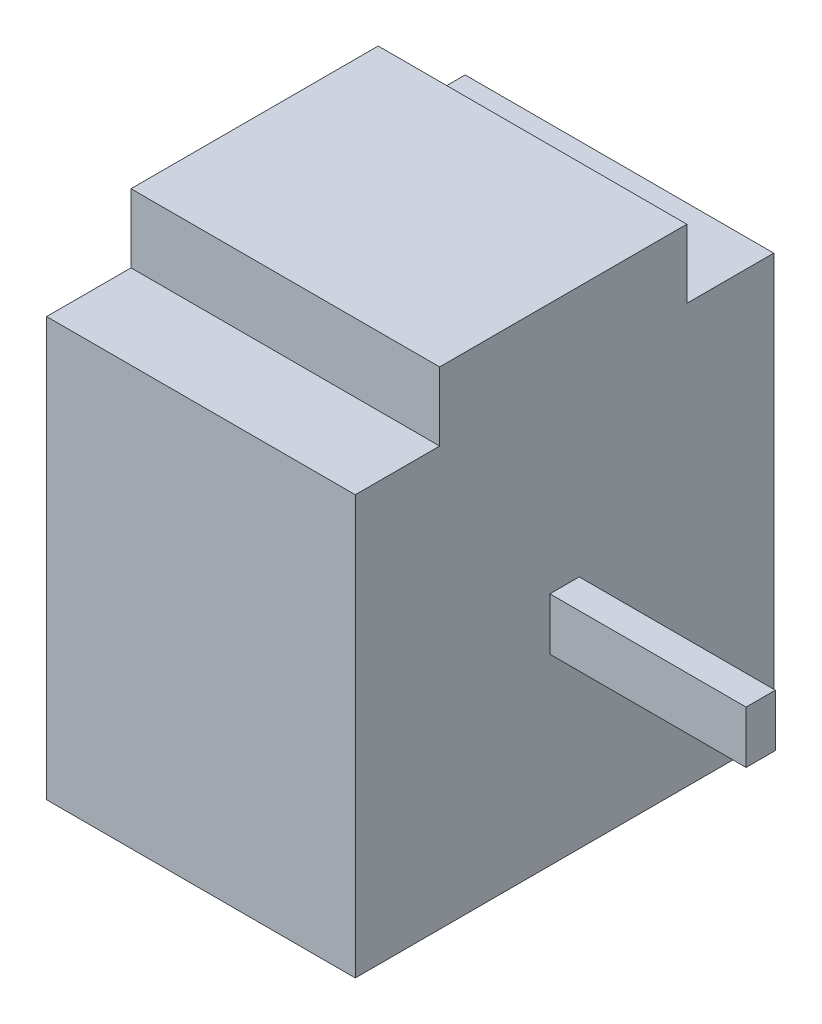
ISO-10303-21;
HEADER;
FILE_DESCRIPTION(('STEP AP214'),'2;1');
FILE_NAME('part.step','',(''),(''),'','','');
FILE_SCHEMA(('AUTOMOTIVE_DESIGN { 1 0 10303 214 1 1 1 1 }'));
ENDSEC;
DATA;
#1=APPLICATION_CONTEXT('core data for automotive mechanical design processes');
#2=APPLICATION_PROTOCOL_DEFINITION('international standard','automotive_design',2000,#1);
#3=PRODUCT_CONTEXT('',#1,'mechanical');
#4=PRODUCT('Part','Part','',(#3));
#5=PRODUCT_RELATED_PRODUCT_CATEGORY('part','',(#4));
#6=PRODUCT_DEFINITION_FORMATION('','',#4);
#7=PRODUCT_DEFINITION_CONTEXT('part definition',#1,'design');
#8=PRODUCT_DEFINITION('design','',#6,#7);
#9=PRODUCT_DEFINITION_SHAPE('','',#8);
#10=(LENGTH_UNIT() NAMED_UNIT(*) SI_UNIT(.MILLI.,.METRE.));
#11=(NAMED_UNIT(*) PLANE_ANGLE_UNIT() SI_UNIT($,.RADIAN.));
#12=(NAMED_UNIT(*) SI_UNIT($,.STERADIAN.) SOLID_ANGLE_UNIT());
#13=UNCERTAINTY_MEASURE_WITH_UNIT(LENGTH_MEASURE(1.E-05),#10,'distance_accuracy_value','');
#14=(GEOMETRIC_REPRESENTATION_CONTEXT(3) GLOBAL_UNCERTAINTY_ASSIGNED_CONTEXT((#13)) GLOBAL_UNIT_ASSIGNED_CONTEXT((#10,
#11,#12)) REPRESENTATION_CONTEXT('',''));
#15=CARTESIAN_POINT('',(0.,0.,0.));
#16=DIRECTION('',(0.,0.,1.));
#17=DIRECTION('',(1.,0.,0.));
#18=AXIS2_PLACEMENT_3D('',#15,#16,#17);
#19=CARTESIAN_POINT('',(11.8,18.62,-3.22499999999999));
#20=DIRECTION('',(0.,1.,0.));
#21=DIRECTION('',(0.,0.,1.));
#22=AXIS2_PLACEMENT_3D('',#19,#20,#21);
#23=PLANE('',#22);
#24=DIRECTION('',(0.,0.,-1.));
#25=VECTOR('',#24,1.);
#26=CARTESIAN_POINT('',(0.,18.62,-3.22499999999999));
#27=LINE('',#26,#25);
#28=CARTESIAN_POINT('',(0.,18.62,-3.22499999999999));
#29=VERTEX_POINT('',#28);
#30=CARTESIAN_POINT('',(0.,18.62,-12.675));
#31=VERTEX_POINT('',#30);
#32=EDGE_CURVE('E146',#29,#31,#27,.T.);
#33=ORIENTED_EDGE('',*,*,#32,.F.);
#34=DIRECTION('',(-1.,0.,0.));
#35=VECTOR('',#34,1.);
#36=CARTESIAN_POINT('',(11.8,18.62,-3.22499999999999));
#37=LINE('',#36,#35);
#38=CARTESIAN_POINT('',(11.8,18.62,-3.22499999999999));
#39=VERTEX_POINT('',#38);
#40=EDGE_CURVE('E12',#39,#29,#37,.T.);
#41=ORIENTED_EDGE('',*,*,#40,.F.);
#42=DIRECTION('',(0.,0.,-1.));
#43=VECTOR('',#42,1.);
#44=CARTESIAN_POINT('',(11.8,18.62,-3.22499999999999));
#45=LINE('',#44,#43);
#46=CARTESIAN_POINT('',(11.8,18.62,-12.675));
#47=VERTEX_POINT('',#46);
#48=EDGE_CURVE('E216',#39,#47,#45,.T.);
#49=ORIENTED_EDGE('',*,*,#48,.T.);
#50=DIRECTION('',(-1.,0.,0.));
#51=VECTOR('',#50,1.);
#52=CARTESIAN_POINT('',(11.8,18.62,-12.675));
#53=LINE('',#52,#51);
#54=EDGE_CURVE('E228',#47,#31,#53,.T.);
#55=ORIENTED_EDGE('',*,*,#54,.T.);
#56=EDGE_LOOP('',(#33,#41,#49,#55));
#57=FACE_BOUND('',#56,.T.);
#58=ADVANCED_FACE('F65',(#57),#23,.T.);
#59=CARTESIAN_POINT('',(11.8,16.,-3.22499999999999));
#60=DIRECTION('',(0.,0.,1.));
#61=DIRECTION('',(0.,-1.,0.));
#62=AXIS2_PLACEMENT_3D('',#59,#60,#61);
#63=PLANE('',#62);
#64=DIRECTION('',(0.,1.,0.));
#65=VECTOR('',#64,1.);
#66=CARTESIAN_POINT('',(0.,16.,-3.22499999999999));
#67=LINE('',#66,#65);
#68=CARTESIAN_POINT('',(0.,16.,-3.22499999999999));
#69=VERTEX_POINT('',#68);
#70=EDGE_CURVE('E220',#69,#29,#67,.T.);
#71=ORIENTED_EDGE('',*,*,#70,.F.);
#72=DIRECTION('',(-1.,0.,0.));
#73=VECTOR('',#72,1.);
#74=CARTESIAN_POINT('',(11.8,16.,-3.22499999999999));
#75=LINE('',#74,#73);
#76=CARTESIAN_POINT('',(11.8,16.,-3.22499999999999));
#77=VERTEX_POINT('',#76);
#78=EDGE_CURVE('E75',#77,#69,#75,.T.);
#79=ORIENTED_EDGE('',*,*,#78,.F.);
#80=DIRECTION('',(0.,1.,0.));
#81=VECTOR('',#80,1.);
#82=CARTESIAN_POINT('',(11.8,16.,-3.22499999999999));
#83=LINE('',#82,#81);
#84=EDGE_CURVE('E224',#77,#39,#83,.T.);
#85=ORIENTED_EDGE('',*,*,#84,.T.);
#86=ORIENTED_EDGE('',*,*,#40,.T.);
#87=EDGE_LOOP('',(#71,#79,#85,#86));
#88=FACE_BOUND('',#87,.T.);
#89=ADVANCED_FACE('F346',(#88),#63,.T.);
#90=CARTESIAN_POINT('',(11.8,16.,-12.675));
#91=DIRECTION('',(0.,0.,1.));
#92=DIRECTION('',(1.,0.,0.));
#93=AXIS2_PLACEMENT_3D('',#90,#91,#92);
#94=PLANE('',#93);
#95=DIRECTION('',(0.,1.,0.));
#96=VECTOR('',#95,1.);
#97=CARTESIAN_POINT('',(0.,16.,-12.675));
#98=LINE('',#97,#96);
#99=CARTESIAN_POINT('',(0.,16.,-12.675));
#100=VERTEX_POINT('',#99);
#101=EDGE_CURVE('E197',#100,#31,#98,.T.);
#102=ORIENTED_EDGE('',*,*,#101,.T.);
#103=ORIENTED_EDGE('',*,*,#54,.F.);
#104=DIRECTION('',(0.,1.,0.));
#105=VECTOR('',#104,1.);
#106=CARTESIAN_POINT('',(11.8,16.,-12.675));
#107=LINE('',#106,#105);
#108=CARTESIAN_POINT('',(11.8,16.,-12.675));
#109=VERTEX_POINT('',#108);
#110=EDGE_CURVE('E219',#109,#47,#107,.T.);
#111=ORIENTED_EDGE('',*,*,#110,.F.);
#112=DIRECTION('',(-1.,0.,0.));
#113=VECTOR('',#112,1.);
#114=CARTESIAN_POINT('',(11.8,16.,-12.675));
#115=LINE('',#114,#113);
#116=EDGE_CURVE('E237',#109,#100,#115,.T.);
#117=ORIENTED_EDGE('',*,*,#116,.T.);
#118=EDGE_LOOP('',(#102,#103,#111,#117));
#119=FACE_BOUND('',#118,.T.);
#120=ADVANCED_FACE('F271',(#119),#94,.F.);
#121=CARTESIAN_POINT('',(11.8,0.,0.));
#122=DIRECTION('',(1.,0.,0.));
#123=DIRECTION('',(0.,0.,-1.));
#124=AXIS2_PLACEMENT_3D('',#121,#122,#123);
#125=PLANE('',#124);
#126=DIRECTION('',(0.,-1.,0.));
#127=VECTOR('',#126,1.);
#128=CARTESIAN_POINT('',(11.8,0.,-8.56));
#129=LINE('',#128,#127);
#130=CARTESIAN_POINT('',(11.8,8.99999999999999,-8.56));
#131=VERTEX_POINT('',#130);
#132=CARTESIAN_POINT('',(11.8,7.,-8.56));
#133=VERTEX_POINT('',#132);
#134=EDGE_CURVE('E295',#131,#133,#129,.T.);
#135=ORIENTED_EDGE('',*,*,#134,.T.);
#136=DIRECTION('',(0.,0.,-1.));
#137=VECTOR('',#136,1.);
#138=CARTESIAN_POINT('',(11.8,7.,0.));
#139=LINE('',#138,#137);
#140=CARTESIAN_POINT('',(11.8,7.,-7.43999999999999));
#141=VERTEX_POINT('',#140);
#142=EDGE_CURVE('E304',#141,#133,#139,.T.);
#143=ORIENTED_EDGE('',*,*,#142,.F.);
#144=DIRECTION('',(0.,-1.,0.));
#145=VECTOR('',#144,1.);
#146=CARTESIAN_POINT('',(11.8,0.,-7.44));
#147=LINE('',#146,#145);
#148=CARTESIAN_POINT('',(11.8,8.99999999999999,-7.43999999999999));
#149=VERTEX_POINT('',#148);
#150=EDGE_CURVE('E321',#149,#141,#147,.T.);
#151=ORIENTED_EDGE('',*,*,#150,.F.);
#152=DIRECTION('',(0.,0.,-1.));
#153=VECTOR('',#152,1.);
#154=CARTESIAN_POINT('',(11.8,8.99999999999999,0.));
#155=LINE('',#154,#153);
#156=EDGE_CURVE('E318',#149,#131,#155,.T.);
#157=ORIENTED_EDGE('',*,*,#156,.T.);
#158=EDGE_LOOP('',(#135,#143,#151,#157));
#159=FACE_BOUND('',#158,.T.);
#160=ORIENTED_EDGE('',*,*,#48,.F.);
#161=ORIENTED_EDGE('',*,*,#84,.F.);
#162=DIRECTION('',(0.,0.,-1.));
#163=VECTOR('',#162,1.);
#164=CARTESIAN_POINT('',(11.8,16.,0.));
#165=LINE('',#164,#163);
#166=CARTESIAN_POINT('',(11.8,16.,0.));
#167=VERTEX_POINT('',#166);
#168=EDGE_CURVE('E168',#167,#77,#165,.T.);
#169=ORIENTED_EDGE('',*,*,#168,.F.);
#170=DIRECTION('',(0.,1.,0.));
#171=VECTOR('',#170,1.);
#172=CARTESIAN_POINT('',(11.8,0.,0.));
#173=LINE('',#172,#171);
#174=CARTESIAN_POINT('',(11.8,0.,0.));
#175=VERTEX_POINT('',#174);
#176=EDGE_CURVE('E141',#175,#167,#173,.T.);
#177=ORIENTED_EDGE('',*,*,#176,.F.);
#178=DIRECTION('',(0.,0.,-1.));
#179=VECTOR('',#178,1.);
#180=CARTESIAN_POINT('',(11.8,0.,0.));
#181=LINE('',#180,#179);
#182=CARTESIAN_POINT('',(11.8,0.,-16.));
#183=VERTEX_POINT('',#182);
#184=EDGE_CURVE('E187',#175,#183,#181,.T.);
#185=ORIENTED_EDGE('',*,*,#184,.T.);
#186=DIRECTION('',(0.,1.,0.));
#187=VECTOR('',#186,1.);
#188=CARTESIAN_POINT('',(11.8,0.,-16.));
#189=LINE('',#188,#187);
#190=CARTESIAN_POINT('',(11.8,16.,-16.));
#191=VERTEX_POINT('',#190);
#192=EDGE_CURVE('E190',#183,#191,#189,.T.);
#193=ORIENTED_EDGE('',*,*,#192,.T.);
#194=EDGE_CURVE('E164',#109,#191,#165,.T.);
#195=ORIENTED_EDGE('',*,*,#194,.F.);
#196=ORIENTED_EDGE('',*,*,#110,.T.);
#197=EDGE_LOOP('',(#160,#161,#169,#177,#185,#193,#195,#196));
#198=FACE_BOUND('',#197,.T.);
#199=ADVANCED_FACE('F246',(#159,#198),#125,.T.);
#200=CARTESIAN_POINT('',(0.,0.,0.));
#201=DIRECTION('',(1.,0.,0.));
#202=DIRECTION('',(0.,0.,-1.));
#203=AXIS2_PLACEMENT_3D('',#200,#201,#202);
#204=PLANE('',#203);
#205=ORIENTED_EDGE('',*,*,#32,.T.);
#206=ORIENTED_EDGE('',*,*,#101,.F.);
#207=DIRECTION('',(0.,0.,-1.));
#208=VECTOR('',#207,1.);
#209=CARTESIAN_POINT('',(0.,16.,0.));
#210=LINE('',#209,#208);
#211=CARTESIAN_POINT('',(0.,16.,-16.));
#212=VERTEX_POINT('',#211);
#213=EDGE_CURVE('E156',#100,#212,#210,.T.);
#214=ORIENTED_EDGE('',*,*,#213,.T.);
#215=DIRECTION('',(0.,1.,0.));
#216=VECTOR('',#215,1.);
#217=CARTESIAN_POINT('',(0.,0.,-16.));
#218=LINE('',#217,#216);
#219=CARTESIAN_POINT('',(0.,0.,-16.));
#220=VERTEX_POINT('',#219);
#221=EDGE_CURVE('E155',#220,#212,#218,.T.);
#222=ORIENTED_EDGE('',*,*,#221,.F.);
#223=DIRECTION('',(0.,0.,-1.));
#224=VECTOR('',#223,1.);
#225=CARTESIAN_POINT('',(0.,0.,0.));
#226=LINE('',#225,#224);
#227=CARTESIAN_POINT('',(0.,0.,0.));
#228=VERTEX_POINT('',#227);
#229=EDGE_CURVE('E162',#228,#220,#226,.T.);
#230=ORIENTED_EDGE('',*,*,#229,.F.);
#231=DIRECTION('',(0.,1.,0.));
#232=VECTOR('',#231,1.);
#233=CARTESIAN_POINT('',(0.,0.,0.));
#234=LINE('',#233,#232);
#235=CARTESIAN_POINT('',(0.,16.,0.));
#236=VERTEX_POINT('',#235);
#237=EDGE_CURVE('E139',#228,#236,#234,.T.);
#238=ORIENTED_EDGE('',*,*,#237,.T.);
#239=EDGE_CURVE('E150',#236,#69,#210,.T.);
#240=ORIENTED_EDGE('',*,*,#239,.T.);
#241=ORIENTED_EDGE('',*,*,#70,.T.);
#242=EDGE_LOOP('',(#205,#206,#214,#222,#230,#238,#240,#241));
#243=FACE_BOUND('',#242,.T.);
#244=ADVANCED_FACE('F160',(#243),#204,.F.);
#245=CARTESIAN_POINT('',(11.8,0.,0.));
#246=DIRECTION('',(0.,1.,0.));
#247=DIRECTION('',(0.,0.,1.));
#248=AXIS2_PLACEMENT_3D('',#245,#246,#247);
#249=PLANE('',#248);
#250=ORIENTED_EDGE('',*,*,#229,.T.);
#251=DIRECTION('',(-1.,0.,0.));
#252=VECTOR('',#251,1.);
#253=CARTESIAN_POINT('',(11.8,0.,-16.));
#254=LINE('',#253,#252);
#255=EDGE_CURVE('E174',#183,#220,#254,.T.);
#256=ORIENTED_EDGE('',*,*,#255,.F.);
#257=ORIENTED_EDGE('',*,*,#184,.F.);
#258=DIRECTION('',(-1.,0.,0.));
#259=VECTOR('',#258,1.);
#260=CARTESIAN_POINT('',(11.8,0.,0.));
#261=LINE('',#260,#259);
#262=EDGE_CURVE('E147',#175,#228,#261,.T.);
#263=ORIENTED_EDGE('',*,*,#262,.T.);
#264=EDGE_LOOP('',(#250,#256,#257,#263));
#265=FACE_BOUND('',#264,.T.);
#266=ADVANCED_FACE('F250',(#265),#249,.F.);
#267=CARTESIAN_POINT('',(11.8,0.,-16.));
#268=DIRECTION('',(0.,0.,1.));
#269=DIRECTION('',(1.,0.,0.));
#270=AXIS2_PLACEMENT_3D('',#267,#268,#269);
#271=PLANE('',#270);
#272=ORIENTED_EDGE('',*,*,#221,.T.);
#273=DIRECTION('',(-1.,0.,0.));
#274=VECTOR('',#273,1.);
#275=CARTESIAN_POINT('',(11.8,16.,-16.));
#276=LINE('',#275,#274);
#277=EDGE_CURVE('E69',#191,#212,#276,.T.);
#278=ORIENTED_EDGE('',*,*,#277,.F.);
#279=ORIENTED_EDGE('',*,*,#192,.F.);
#280=ORIENTED_EDGE('',*,*,#255,.T.);
#281=EDGE_LOOP('',(#272,#278,#279,#280));
#282=FACE_BOUND('',#281,.T.);
#283=ADVANCED_FACE('F194',(#282),#271,.F.);
#284=CARTESIAN_POINT('',(11.8,0.,0.));
#285=DIRECTION('',(0.,0.,1.));
#286=DIRECTION('',(0.,-1.,0.));
#287=AXIS2_PLACEMENT_3D('',#284,#285,#286);
#288=PLANE('',#287);
#289=ORIENTED_EDGE('',*,*,#237,.F.);
#290=ORIENTED_EDGE('',*,*,#262,.F.);
#291=ORIENTED_EDGE('',*,*,#176,.T.);
#292=DIRECTION('',(-1.,0.,0.));
#293=VECTOR('',#292,1.);
#294=CARTESIAN_POINT('',(11.8,16.,0.));
#295=LINE('',#294,#293);
#296=EDGE_CURVE('E135',#167,#236,#295,.T.);
#297=ORIENTED_EDGE('',*,*,#296,.T.);
#298=EDGE_LOOP('',(#289,#290,#291,#297));
#299=FACE_BOUND('',#298,.T.);
#300=ADVANCED_FACE('F137',(#299),#288,.T.);
#301=CARTESIAN_POINT('',(11.8,16.,0.));
#302=DIRECTION('',(0.,1.,0.));
#303=DIRECTION('',(0.,0.,1.));
#304=AXIS2_PLACEMENT_3D('',#301,#302,#303);
#305=PLANE('',#304);
#306=ORIENTED_EDGE('',*,*,#168,.T.);
#307=ORIENTED_EDGE('',*,*,#78,.T.);
#308=ORIENTED_EDGE('',*,*,#239,.F.);
#309=ORIENTED_EDGE('',*,*,#296,.F.);
#310=EDGE_LOOP('',(#306,#307,#308,#309));
#311=FACE_BOUND('',#310,.T.);
#312=ADVANCED_FACE('F67',(#311),#305,.T.);
#313=ORIENTED_EDGE('',*,*,#116,.F.);
#314=ORIENTED_EDGE('',*,*,#194,.T.);
#315=ORIENTED_EDGE('',*,*,#277,.T.);
#316=ORIENTED_EDGE('',*,*,#213,.F.);
#317=EDGE_LOOP('',(#313,#314,#315,#316));
#318=FACE_BOUND('',#317,.T.);
#319=ADVANCED_FACE('F261',(#318),#305,.T.);
#320=CARTESIAN_POINT('',(19.3,0.,-8.56));
#321=DIRECTION('',(0.,0.,-1.));
#322=DIRECTION('',(-1.,0.,0.));
#323=AXIS2_PLACEMENT_3D('',#320,#321,#322);
#324=PLANE('',#323);
#325=ORIENTED_EDGE('',*,*,#134,.F.);
#326=DIRECTION('',(-1.,0.,0.));
#327=VECTOR('',#326,1.);
#328=CARTESIAN_POINT('',(19.3,8.99999999999999,-8.56));
#329=LINE('',#328,#327);
#330=CARTESIAN_POINT('',(19.3,8.99999999999999,-8.56));
#331=VERTEX_POINT('',#330);
#332=EDGE_CURVE('E200',#331,#131,#329,.T.);
#333=ORIENTED_EDGE('',*,*,#332,.F.);
#334=DIRECTION('',(0.,-1.,0.));
#335=VECTOR('',#334,1.);
#336=CARTESIAN_POINT('',(19.3,0.,-8.56));
#337=LINE('',#336,#335);
#338=CARTESIAN_POINT('',(19.3,7.,-8.56));
#339=VERTEX_POINT('',#338);
#340=EDGE_CURVE('E293',#331,#339,#337,.T.);
#341=ORIENTED_EDGE('',*,*,#340,.T.);
#342=DIRECTION('',(-1.,0.,0.));
#343=VECTOR('',#342,1.);
#344=CARTESIAN_POINT('',(19.3,7.,-8.56));
#345=LINE('',#344,#343);
#346=EDGE_CURVE('E315',#339,#133,#345,.T.);
#347=ORIENTED_EDGE('',*,*,#346,.T.);
#348=EDGE_LOOP('',(#325,#333,#341,#347));
#349=FACE_BOUND('',#348,.T.);
#350=ADVANCED_FACE('F258',(#349),#324,.T.);
#351=CARTESIAN_POINT('',(19.3,8.99999999999999,0.));
#352=DIRECTION('',(0.,1.,0.));
#353=DIRECTION('',(0.,0.,1.));
#354=AXIS2_PLACEMENT_3D('',#351,#352,#353);
#355=PLANE('',#354);
#356=ORIENTED_EDGE('',*,*,#156,.F.);
#357=DIRECTION('',(-1.,0.,0.));
#358=VECTOR('',#357,1.);
#359=CARTESIAN_POINT('',(19.3,8.99999999999999,-7.43999999999999));
#360=LINE('',#359,#358);
#361=CARTESIAN_POINT('',(19.3,8.99999999999999,-7.43999999999999));
#362=VERTEX_POINT('',#361);
#363=EDGE_CURVE('E203',#362,#149,#360,.T.);
#364=ORIENTED_EDGE('',*,*,#363,.F.);
#365=DIRECTION('',(0.,0.,-1.));
#366=VECTOR('',#365,1.);
#367=CARTESIAN_POINT('',(19.3,8.99999999999999,0.));
#368=LINE('',#367,#366);
#369=EDGE_CURVE('E300',#362,#331,#368,.T.);
#370=ORIENTED_EDGE('',*,*,#369,.T.);
#371=ORIENTED_EDGE('',*,*,#332,.T.);
#372=EDGE_LOOP('',(#356,#364,#370,#371));
#373=FACE_BOUND('',#372,.T.);
#374=ADVANCED_FACE('F267',(#373),#355,.T.);
#375=CARTESIAN_POINT('',(19.3,0.,-7.44));
#376=DIRECTION('',(0.,0.,-1.));
#377=DIRECTION('',(0.,1.,0.));
#378=AXIS2_PLACEMENT_3D('',#375,#376,#377);
#379=PLANE('',#378);
#380=ORIENTED_EDGE('',*,*,#150,.T.);
#381=DIRECTION('',(-1.,0.,0.));
#382=VECTOR('',#381,1.);
#383=CARTESIAN_POINT('',(19.3,7.,-7.43999999999999));
#384=LINE('',#383,#382);
#385=CARTESIAN_POINT('',(19.3,7.,-7.43999999999999));
#386=VERTEX_POINT('',#385);
#387=EDGE_CURVE('E83',#386,#141,#384,.T.);
#388=ORIENTED_EDGE('',*,*,#387,.F.);
#389=DIRECTION('',(0.,-1.,0.));
#390=VECTOR('',#389,1.);
#391=CARTESIAN_POINT('',(19.3,0.,-7.44));
#392=LINE('',#391,#390);
#393=EDGE_CURVE('E308',#362,#386,#392,.T.);
#394=ORIENTED_EDGE('',*,*,#393,.F.);
#395=ORIENTED_EDGE('',*,*,#363,.T.);
#396=EDGE_LOOP('',(#380,#388,#394,#395));
#397=FACE_BOUND('',#396,.T.);
#398=ADVANCED_FACE('F333',(#397),#379,.F.);
#399=CARTESIAN_POINT('',(19.3,7.,0.));
#400=DIRECTION('',(0.,1.,0.));
#401=DIRECTION('',(0.,0.,1.));
#402=AXIS2_PLACEMENT_3D('',#399,#400,#401);
#403=PLANE('',#402);
#404=ORIENTED_EDGE('',*,*,#142,.T.);
#405=ORIENTED_EDGE('',*,*,#346,.F.);
#406=DIRECTION('',(0.,0.,-1.));
#407=VECTOR('',#406,1.);
#408=CARTESIAN_POINT('',(19.3,7.,0.));
#409=LINE('',#408,#407);
#410=EDGE_CURVE('E301',#386,#339,#409,.T.);
#411=ORIENTED_EDGE('',*,*,#410,.F.);
#412=ORIENTED_EDGE('',*,*,#387,.T.);
#413=EDGE_LOOP('',(#404,#405,#411,#412));
#414=FACE_BOUND('',#413,.T.);
#415=ADVANCED_FACE('F329',(#414),#403,.F.);
#416=CARTESIAN_POINT('',(19.3,0.,0.));
#417=DIRECTION('',(1.,0.,0.));
#418=DIRECTION('',(0.,0.,-1.));
#419=AXIS2_PLACEMENT_3D('',#416,#417,#418);
#420=PLANE('',#419);
#421=ORIENTED_EDGE('',*,*,#340,.F.);
#422=ORIENTED_EDGE('',*,*,#369,.F.);
#423=ORIENTED_EDGE('',*,*,#393,.T.);
#424=ORIENTED_EDGE('',*,*,#410,.T.);
#425=EDGE_LOOP('',(#421,#422,#423,#424));
#426=FACE_BOUND('',#425,.T.);
#427=ADVANCED_FACE('F299',(#426),#420,.T.);
#428=CLOSED_SHELL('',(#58,#89,#120,#199,#244,#266,#283,#300,#312,#319,#350,#374,#398,#415,#427));
#429=MANIFOLD_SOLID_BREP('B2',#428);
#430=ADVANCED_BREP_SHAPE_REPRESENTATION('',(#18,#429),#14);
#431=SHAPE_DEFINITION_REPRESENTATION(#9,#430);
ENDSEC;
END-ISO-10303-21;
